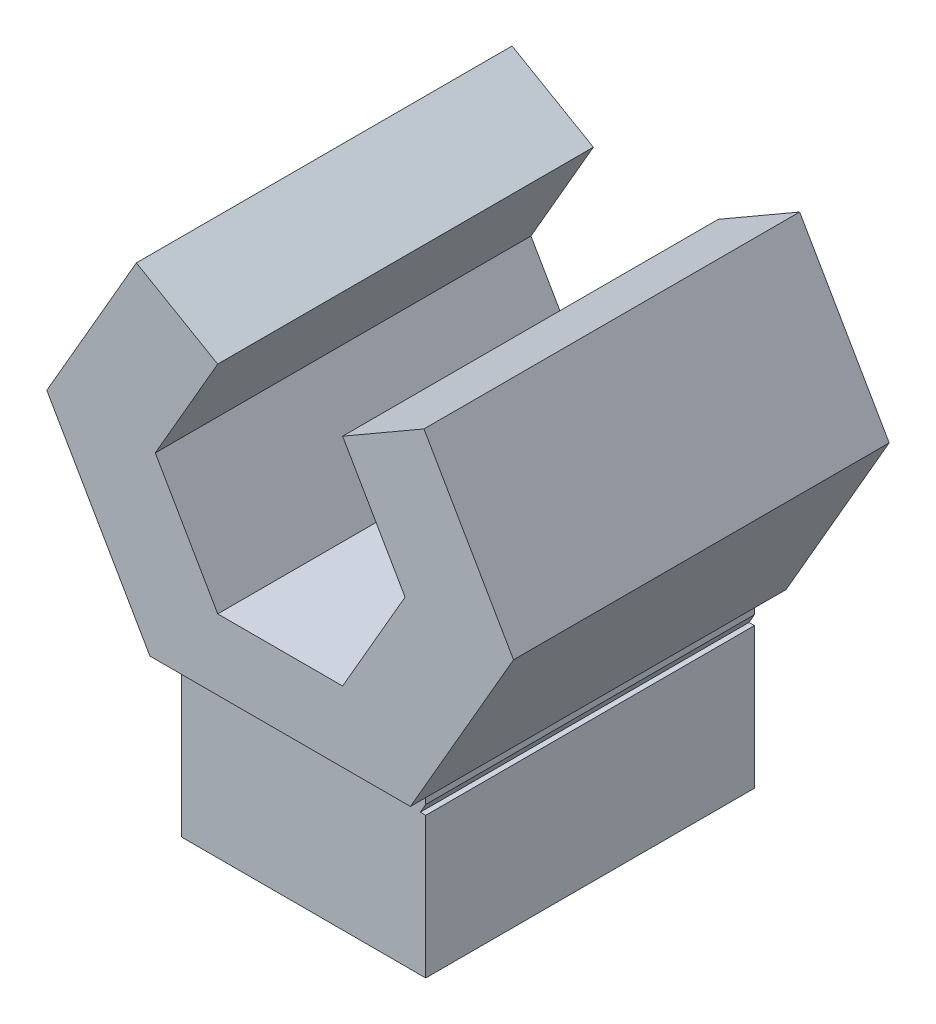
ISO-10303-21;
HEADER;
FILE_DESCRIPTION(('STEP AP214'),'2;1');
FILE_NAME('part.step','',(''),(''),'','','');
FILE_SCHEMA(('AUTOMOTIVE_DESIGN { 1 0 10303 214 1 1 1 1 }'));
ENDSEC;
DATA;
#1=APPLICATION_CONTEXT('core data for automotive mechanical design processes');
#2=APPLICATION_PROTOCOL_DEFINITION('international standard','automotive_design',2000,#1);
#3=PRODUCT_CONTEXT('',#1,'mechanical');
#4=PRODUCT('Part','Part','',(#3));
#5=PRODUCT_RELATED_PRODUCT_CATEGORY('part','',(#4));
#6=PRODUCT_DEFINITION_FORMATION('','',#4);
#7=PRODUCT_DEFINITION_CONTEXT('part definition',#1,'design');
#8=PRODUCT_DEFINITION('design','',#6,#7);
#9=PRODUCT_DEFINITION_SHAPE('','',#8);
#10=(LENGTH_UNIT() NAMED_UNIT(*) SI_UNIT(.MILLI.,.METRE.));
#11=(NAMED_UNIT(*) PLANE_ANGLE_UNIT() SI_UNIT($,.RADIAN.));
#12=(NAMED_UNIT(*) SI_UNIT($,.STERADIAN.) SOLID_ANGLE_UNIT());
#13=UNCERTAINTY_MEASURE_WITH_UNIT(LENGTH_MEASURE(1.E-05),#10,'distance_accuracy_value','');
#14=(GEOMETRIC_REPRESENTATION_CONTEXT(3) GLOBAL_UNCERTAINTY_ASSIGNED_CONTEXT((#13)) GLOBAL_UNIT_ASSIGNED_CONTEXT((#10,
#11,#12)) REPRESENTATION_CONTEXT('',''));
#15=CARTESIAN_POINT('',(0.,0.,0.));
#16=DIRECTION('',(0.,0.,1.));
#17=DIRECTION('',(1.,0.,0.));
#18=AXIS2_PLACEMENT_3D('',#15,#16,#17);
#19=CARTESIAN_POINT('',(-4.9694010767585,0.,8.));
#20=DIRECTION('',(0.866025403784439,0.5,0.));
#21=DIRECTION('',(-0.5,0.866025403784439,0.));
#22=AXIS2_PLACEMENT_3D('',#19,#20,#21);
#23=PLANE('',#22);
#24=DIRECTION('',(0.,0.,-1.));
#25=VECTOR('',#24,1.);
#26=CARTESIAN_POINT('',(-2.77337567297406,-3.80362757406661,8.));
#27=LINE('',#26,#25);
#28=CARTESIAN_POINT('',(-2.77337567297406,-3.80362757406661,8.));
#29=VERTEX_POINT('',#28);
#30=CARTESIAN_POINT('',(-2.77337567297406,-3.80362757406661,0.));
#31=VERTEX_POINT('',#30);
#32=EDGE_CURVE('E52',#29,#31,#27,.T.);
#33=ORIENTED_EDGE('',*,*,#32,.F.);
#34=DIRECTION('',(0.5,-0.866025403784439,0.));
#35=VECTOR('',#34,1.);
#36=CARTESIAN_POINT('',(-4.9694010767585,0.,8.));
#37=LINE('',#36,#35);
#38=CARTESIAN_POINT('',(-4.9694010767585,0.,8.));
#39=VERTEX_POINT('',#38);
#40=EDGE_CURVE('E306',#39,#29,#37,.T.);
#41=ORIENTED_EDGE('',*,*,#40,.F.);
#42=DIRECTION('',(0.,0.,-1.));
#43=VECTOR('',#42,1.);
#44=CARTESIAN_POINT('',(-4.9694010767585,0.,8.));
#45=LINE('',#44,#43);
#46=CARTESIAN_POINT('',(-4.9694010767585,0.,0.));
#47=VERTEX_POINT('',#46);
#48=EDGE_CURVE('E367',#39,#47,#45,.T.);
#49=ORIENTED_EDGE('',*,*,#48,.T.);
#50=DIRECTION('',(0.5,-0.866025403784439,0.));
#51=VECTOR('',#50,1.);
#52=CARTESIAN_POINT('',(-4.9694010767585,0.,0.));
#53=LINE('',#52,#51);
#54=EDGE_CURVE('E330',#47,#31,#53,.T.);
#55=ORIENTED_EDGE('',*,*,#54,.T.);
#56=EDGE_LOOP('',(#33,#41,#49,#55));
#57=FACE_BOUND('',#56,.T.);
#58=ADVANCED_FACE('F38',(#57),#23,.F.);
#59=CARTESIAN_POINT('',(2.48470053837924,-4.30362757406661,8.));
#60=DIRECTION('',(-0.866025403784439,0.5,0.));
#61=DIRECTION('',(-0.5,-0.866025403784439,0.));
#62=AXIS2_PLACEMENT_3D('',#59,#60,#61);
#63=PLANE('',#62);
#64=DIRECTION('',(0.,0.,1.));
#65=VECTOR('',#64,1.);
#66=CARTESIAN_POINT('',(2.77337567297406,-3.80362757406661,8.));
#67=LINE('',#66,#65);
#68=CARTESIAN_POINT('',(2.77337567297406,-3.80362757406661,0.));
#69=VERTEX_POINT('',#68);
#70=CARTESIAN_POINT('',(2.77337567297406,-3.80362757406661,8.));
#71=VERTEX_POINT('',#70);
#72=EDGE_CURVE('E289',#69,#71,#67,.T.);
#73=ORIENTED_EDGE('',*,*,#72,.F.);
#74=DIRECTION('',(0.5,0.866025403784439,0.));
#75=VECTOR('',#74,1.);
#76=CARTESIAN_POINT('',(2.48470053837924,-4.30362757406661,0.));
#77=LINE('',#76,#75);
#78=CARTESIAN_POINT('',(4.9694010767585,0.,0.));
#79=VERTEX_POINT('',#78);
#80=EDGE_CURVE('E333',#69,#79,#77,.T.);
#81=ORIENTED_EDGE('',*,*,#80,.T.);
#82=DIRECTION('',(0.,0.,-1.));
#83=VECTOR('',#82,1.);
#84=CARTESIAN_POINT('',(4.9694010767585,0.,8.));
#85=LINE('',#84,#83);
#86=CARTESIAN_POINT('',(4.9694010767585,0.,8.));
#87=VERTEX_POINT('',#86);
#88=EDGE_CURVE('E358',#87,#79,#85,.T.);
#89=ORIENTED_EDGE('',*,*,#88,.F.);
#90=DIRECTION('',(0.5,0.866025403784439,0.));
#91=VECTOR('',#90,1.);
#92=CARTESIAN_POINT('',(2.48470053837924,-4.30362757406661,8.));
#93=LINE('',#92,#91);
#94=EDGE_CURVE('E309',#71,#87,#93,.T.);
#95=ORIENTED_EDGE('',*,*,#94,.F.);
#96=EDGE_LOOP('',(#73,#81,#89,#95));
#97=FACE_BOUND('',#96,.T.);
#98=ADVANCED_FACE('F447',(#97),#63,.F.);
#99=CARTESIAN_POINT('',(0.,0.,8.));
#100=DIRECTION('',(0.,0.,1.));
#101=DIRECTION('',(1.,0.,0.));
#102=AXIS2_PLACEMENT_3D('',#99,#100,#101);
#103=PLANE('',#102);
#104=ORIENTED_EDGE('',*,*,#40,.T.);
#105=DIRECTION('',(1.,0.,0.));
#106=VECTOR('',#105,1.);
#107=CARTESIAN_POINT('',(0.,-3.80362757406661,8.));
#108=LINE('',#107,#106);
#109=EDGE_CURVE('E292',#29,#71,#108,.T.);
#110=ORIENTED_EDGE('',*,*,#109,.T.);
#111=ORIENTED_EDGE('',*,*,#94,.T.);
#112=DIRECTION('',(-0.5,0.866025403784439,0.));
#113=VECTOR('',#112,1.);
#114=CARTESIAN_POINT('',(4.9694010767585,0.,8.));
#115=LINE('',#114,#113);
#116=CARTESIAN_POINT('',(3.06205080756887,3.30362757406661,8.));
#117=VERTEX_POINT('',#116);
#118=EDGE_CURVE('E311',#87,#117,#115,.T.);
#119=ORIENTED_EDGE('',*,*,#118,.T.);
#120=DIRECTION('',(-0.866025403784438,-0.5,0.));
#121=VECTOR('',#120,1.);
#122=CARTESIAN_POINT('',(1.32999999999999,2.30362757406661,8.));
#123=LINE('',#122,#121);
#124=CARTESIAN_POINT('',(1.32999999999999,2.30362757406661,8.));
#125=VERTEX_POINT('',#124);
#126=EDGE_CURVE('E313',#117,#125,#123,.T.);
#127=ORIENTED_EDGE('',*,*,#126,.T.);
#128=DIRECTION('',(0.5,-0.866025403784438,0.));
#129=VECTOR('',#128,1.);
#130=CARTESIAN_POINT('',(2.66,0.,8.));
#131=LINE('',#130,#129);
#132=CARTESIAN_POINT('',(2.66,0.,8.));
#133=VERTEX_POINT('',#132);
#134=EDGE_CURVE('E315',#125,#133,#131,.T.);
#135=ORIENTED_EDGE('',*,*,#134,.T.);
#136=DIRECTION('',(-0.500000000000001,-0.866025403784438,0.));
#137=VECTOR('',#136,1.);
#138=CARTESIAN_POINT('',(1.32999999999999,-2.30362757406661,8.));
#139=LINE('',#138,#137);
#140=CARTESIAN_POINT('',(1.32999999999999,-2.30362757406661,8.));
#141=VERTEX_POINT('',#140);
#142=EDGE_CURVE('E317',#133,#141,#139,.T.);
#143=ORIENTED_EDGE('',*,*,#142,.T.);
#144=DIRECTION('',(-1.,0.,0.));
#145=VECTOR('',#144,1.);
#146=CARTESIAN_POINT('',(-1.33,-2.30362757406661,8.));
#147=LINE('',#146,#145);
#148=CARTESIAN_POINT('',(-1.33,-2.30362757406661,8.));
#149=VERTEX_POINT('',#148);
#150=EDGE_CURVE('E319',#141,#149,#147,.T.);
#151=ORIENTED_EDGE('',*,*,#150,.T.);
#152=DIRECTION('',(-0.499999999999997,0.86602540378444,0.));
#153=VECTOR('',#152,1.);
#154=CARTESIAN_POINT('',(-2.66,0.,8.));
#155=LINE('',#154,#153);
#156=CARTESIAN_POINT('',(-2.66,0.,8.));
#157=VERTEX_POINT('',#156);
#158=EDGE_CURVE('E296',#149,#157,#155,.T.);
#159=ORIENTED_EDGE('',*,*,#158,.T.);
#160=DIRECTION('',(0.499999999999999,0.866025403784439,0.));
#161=VECTOR('',#160,1.);
#162=CARTESIAN_POINT('',(-1.33,2.30362757406661,8.));
#163=LINE('',#162,#161);
#164=CARTESIAN_POINT('',(-1.33,2.30362757406661,8.));
#165=VERTEX_POINT('',#164);
#166=EDGE_CURVE('E299',#157,#165,#163,.T.);
#167=ORIENTED_EDGE('',*,*,#166,.T.);
#168=DIRECTION('',(-0.866025403784439,0.5,0.));
#169=VECTOR('',#168,1.);
#170=CARTESIAN_POINT('',(-3.06205080756888,3.30362757406661,8.));
#171=LINE('',#170,#169);
#172=CARTESIAN_POINT('',(-3.06205080756888,3.30362757406661,8.));
#173=VERTEX_POINT('',#172);
#174=EDGE_CURVE('E302',#165,#173,#171,.T.);
#175=ORIENTED_EDGE('',*,*,#174,.T.);
#176=DIRECTION('',(-0.5,-0.866025403784438,0.));
#177=VECTOR('',#176,1.);
#178=CARTESIAN_POINT('',(-3.06205080756888,3.30362757406661,8.));
#179=LINE('',#178,#177);
#180=EDGE_CURVE('E304',#173,#39,#179,.T.);
#181=ORIENTED_EDGE('',*,*,#180,.T.);
#182=EDGE_LOOP('',(#104,#110,#111,#119,#127,#135,#143,#151,#159,#167,#175,#181));
#183=FACE_BOUND('',#182,.T.);
#184=ADVANCED_FACE('F452',(#183),#103,.T.);
#185=CARTESIAN_POINT('',(0.,0.,0.));
#186=DIRECTION('',(0.,0.,1.));
#187=DIRECTION('',(1.,0.,0.));
#188=AXIS2_PLACEMENT_3D('',#185,#186,#187);
#189=PLANE('',#188);
#190=DIRECTION('',(1.,0.,0.));
#191=VECTOR('',#190,1.);
#192=CARTESIAN_POINT('',(0.,-3.80362757406661,0.));
#193=LINE('',#192,#191);
#194=EDGE_CURVE('E12',#31,#69,#193,.T.);
#195=ORIENTED_EDGE('',*,*,#194,.F.);
#196=ORIENTED_EDGE('',*,*,#54,.F.);
#197=DIRECTION('',(-0.5,-0.866025403784438,0.));
#198=VECTOR('',#197,1.);
#199=CARTESIAN_POINT('',(-3.06205080756888,3.30362757406661,0.));
#200=LINE('',#199,#198);
#201=CARTESIAN_POINT('',(-3.06205080756888,3.30362757406661,0.));
#202=VERTEX_POINT('',#201);
#203=EDGE_CURVE('E328',#202,#47,#200,.T.);
#204=ORIENTED_EDGE('',*,*,#203,.F.);
#205=DIRECTION('',(-0.866025403784439,0.5,0.));
#206=VECTOR('',#205,1.);
#207=CARTESIAN_POINT('',(-3.06205080756888,3.30362757406661,0.));
#208=LINE('',#207,#206);
#209=CARTESIAN_POINT('',(-1.33,2.30362757406661,0.));
#210=VERTEX_POINT('',#209);
#211=EDGE_CURVE('E326',#210,#202,#208,.T.);
#212=ORIENTED_EDGE('',*,*,#211,.F.);
#213=DIRECTION('',(0.499999999999999,0.866025403784439,0.));
#214=VECTOR('',#213,1.);
#215=CARTESIAN_POINT('',(-1.33,2.30362757406661,0.));
#216=LINE('',#215,#214);
#217=CARTESIAN_POINT('',(-2.66,0.,0.));
#218=VERTEX_POINT('',#217);
#219=EDGE_CURVE('E324',#218,#210,#216,.T.);
#220=ORIENTED_EDGE('',*,*,#219,.F.);
#221=DIRECTION('',(-0.499999999999997,0.86602540378444,0.));
#222=VECTOR('',#221,1.);
#223=CARTESIAN_POINT('',(-2.66,0.,0.));
#224=LINE('',#223,#222);
#225=CARTESIAN_POINT('',(-1.33,-2.30362757406661,0.));
#226=VERTEX_POINT('',#225);
#227=EDGE_CURVE('E295',#226,#218,#224,.T.);
#228=ORIENTED_EDGE('',*,*,#227,.F.);
#229=DIRECTION('',(-1.,0.,0.));
#230=VECTOR('',#229,1.);
#231=CARTESIAN_POINT('',(-1.33,-2.30362757406661,0.));
#232=LINE('',#231,#230);
#233=CARTESIAN_POINT('',(1.32999999999999,-2.30362757406661,0.));
#234=VERTEX_POINT('',#233);
#235=EDGE_CURVE('E300',#234,#226,#232,.T.);
#236=ORIENTED_EDGE('',*,*,#235,.F.);
#237=DIRECTION('',(-0.500000000000001,-0.866025403784438,0.));
#238=VECTOR('',#237,1.);
#239=CARTESIAN_POINT('',(1.32999999999999,-2.30362757406661,0.));
#240=LINE('',#239,#238);
#241=CARTESIAN_POINT('',(2.66,0.,0.));
#242=VERTEX_POINT('',#241);
#243=EDGE_CURVE('E341',#242,#234,#240,.T.);
#244=ORIENTED_EDGE('',*,*,#243,.F.);
#245=DIRECTION('',(0.5,-0.866025403784438,0.));
#246=VECTOR('',#245,1.);
#247=CARTESIAN_POINT('',(2.66,0.,0.));
#248=LINE('',#247,#246);
#249=CARTESIAN_POINT('',(1.32999999999999,2.30362757406661,0.));
#250=VERTEX_POINT('',#249);
#251=EDGE_CURVE('E339',#250,#242,#248,.T.);
#252=ORIENTED_EDGE('',*,*,#251,.F.);
#253=DIRECTION('',(-0.866025403784438,-0.5,0.));
#254=VECTOR('',#253,1.);
#255=CARTESIAN_POINT('',(1.32999999999999,2.30362757406661,0.));
#256=LINE('',#255,#254);
#257=CARTESIAN_POINT('',(3.06205080756887,3.30362757406661,0.));
#258=VERTEX_POINT('',#257);
#259=EDGE_CURVE('E337',#258,#250,#256,.T.);
#260=ORIENTED_EDGE('',*,*,#259,.F.);
#261=DIRECTION('',(-0.5,0.866025403784439,0.));
#262=VECTOR('',#261,1.);
#263=CARTESIAN_POINT('',(4.9694010767585,0.,0.));
#264=LINE('',#263,#262);
#265=EDGE_CURVE('E335',#79,#258,#264,.T.);
#266=ORIENTED_EDGE('',*,*,#265,.F.);
#267=ORIENTED_EDGE('',*,*,#80,.F.);
#268=EDGE_LOOP('',(#195,#196,#204,#212,#220,#228,#236,#244,#252,#260,#266,#267));
#269=FACE_BOUND('',#268,.T.);
#270=ADVANCED_FACE('F466',(#269),#189,.F.);
#271=CARTESIAN_POINT('',(-2.66,0.,8.));
#272=DIRECTION('',(-0.86602540378444,-0.499999999999997,0.));
#273=DIRECTION('',(0.499999999999997,-0.86602540378444,0.));
#274=AXIS2_PLACEMENT_3D('',#271,#272,#273);
#275=PLANE('',#274);
#276=ORIENTED_EDGE('',*,*,#227,.T.);
#277=DIRECTION('',(0.,0.,-1.));
#278=VECTOR('',#277,1.);
#279=CARTESIAN_POINT('',(-2.66,0.,8.));
#280=LINE('',#279,#278);
#281=EDGE_CURVE('E376',#157,#218,#280,.T.);
#282=ORIENTED_EDGE('',*,*,#281,.F.);
#283=ORIENTED_EDGE('',*,*,#158,.F.);
#284=DIRECTION('',(0.,0.,-1.));
#285=VECTOR('',#284,1.);
#286=CARTESIAN_POINT('',(-1.33,-2.30362757406661,8.));
#287=LINE('',#286,#285);
#288=EDGE_CURVE('E321',#149,#226,#287,.T.);
#289=ORIENTED_EDGE('',*,*,#288,.T.);
#290=EDGE_LOOP('',(#276,#282,#283,#289));
#291=FACE_BOUND('',#290,.T.);
#292=ADVANCED_FACE('F40',(#291),#275,.F.);
#293=CARTESIAN_POINT('',(-1.33,2.30362757406661,8.));
#294=DIRECTION('',(-0.866025403784439,0.499999999999999,0.));
#295=DIRECTION('',(-0.499999999999999,-0.866025403784439,0.));
#296=AXIS2_PLACEMENT_3D('',#293,#294,#295);
#297=PLANE('',#296);
#298=ORIENTED_EDGE('',*,*,#219,.T.);
#299=DIRECTION('',(0.,0.,-1.));
#300=VECTOR('',#299,1.);
#301=CARTESIAN_POINT('',(-1.33,2.30362757406661,8.));
#302=LINE('',#301,#300);
#303=EDGE_CURVE('E373',#165,#210,#302,.T.);
#304=ORIENTED_EDGE('',*,*,#303,.F.);
#305=ORIENTED_EDGE('',*,*,#166,.F.);
#306=ORIENTED_EDGE('',*,*,#281,.T.);
#307=EDGE_LOOP('',(#298,#304,#305,#306));
#308=FACE_BOUND('',#307,.T.);
#309=ADVANCED_FACE('F502',(#308),#297,.F.);
#310=CARTESIAN_POINT('',(-3.06205080756888,3.30362757406661,8.));
#311=DIRECTION('',(-0.5,-0.866025403784439,0.));
#312=DIRECTION('',(0.866025403784439,-0.5,0.));
#313=AXIS2_PLACEMENT_3D('',#310,#311,#312);
#314=PLANE('',#313);
#315=ORIENTED_EDGE('',*,*,#211,.T.);
#316=DIRECTION('',(0.,0.,-1.));
#317=VECTOR('',#316,1.);
#318=CARTESIAN_POINT('',(-3.06205080756888,3.30362757406661,8.));
#319=LINE('',#318,#317);
#320=EDGE_CURVE('E370',#173,#202,#319,.T.);
#321=ORIENTED_EDGE('',*,*,#320,.F.);
#322=ORIENTED_EDGE('',*,*,#174,.F.);
#323=ORIENTED_EDGE('',*,*,#303,.T.);
#324=EDGE_LOOP('',(#315,#321,#322,#323));
#325=FACE_BOUND('',#324,.T.);
#326=ADVANCED_FACE('F504',(#325),#314,.F.);
#327=CARTESIAN_POINT('',(-3.06205080756888,3.30362757406661,8.));
#328=DIRECTION('',(0.866025403784439,-0.5,0.));
#329=DIRECTION('',(0.5,0.866025403784439,0.));
#330=AXIS2_PLACEMENT_3D('',#327,#328,#329);
#331=PLANE('',#330);
#332=ORIENTED_EDGE('',*,*,#203,.T.);
#333=ORIENTED_EDGE('',*,*,#48,.F.);
#334=ORIENTED_EDGE('',*,*,#180,.F.);
#335=ORIENTED_EDGE('',*,*,#320,.T.);
#336=EDGE_LOOP('',(#332,#333,#334,#335));
#337=FACE_BOUND('',#336,.T.);
#338=ADVANCED_FACE('F463',(#337),#331,.F.);
#339=CARTESIAN_POINT('',(4.9694010767585,0.,8.));
#340=DIRECTION('',(-0.866025403784439,-0.5,0.));
#341=DIRECTION('',(0.5,-0.866025403784439,0.));
#342=AXIS2_PLACEMENT_3D('',#339,#340,#341);
#343=PLANE('',#342);
#344=ORIENTED_EDGE('',*,*,#265,.T.);
#345=DIRECTION('',(0.,0.,-1.));
#346=VECTOR('',#345,1.);
#347=CARTESIAN_POINT('',(3.06205080756887,3.30362757406661,8.));
#348=LINE('',#347,#346);
#349=EDGE_CURVE('E355',#117,#258,#348,.T.);
#350=ORIENTED_EDGE('',*,*,#349,.F.);
#351=ORIENTED_EDGE('',*,*,#118,.F.);
#352=ORIENTED_EDGE('',*,*,#88,.T.);
#353=EDGE_LOOP('',(#344,#350,#351,#352));
#354=FACE_BOUND('',#353,.T.);
#355=ADVANCED_FACE('F477',(#354),#343,.F.);
#356=CARTESIAN_POINT('',(1.32999999999999,2.30362757406661,8.));
#357=DIRECTION('',(0.5,-0.866025403784438,0.));
#358=DIRECTION('',(0.866025403784439,0.5,0.));
#359=AXIS2_PLACEMENT_3D('',#356,#357,#358);
#360=PLANE('',#359);
#361=ORIENTED_EDGE('',*,*,#259,.T.);
#362=DIRECTION('',(0.,0.,-1.));
#363=VECTOR('',#362,1.);
#364=CARTESIAN_POINT('',(1.32999999999999,2.30362757406661,8.));
#365=LINE('',#364,#363);
#366=EDGE_CURVE('E352',#125,#250,#365,.T.);
#367=ORIENTED_EDGE('',*,*,#366,.F.);
#368=ORIENTED_EDGE('',*,*,#126,.F.);
#369=ORIENTED_EDGE('',*,*,#349,.T.);
#370=EDGE_LOOP('',(#361,#367,#368,#369));
#371=FACE_BOUND('',#370,.T.);
#372=ADVANCED_FACE('F480',(#371),#360,.F.);
#373=CARTESIAN_POINT('',(2.66,0.,8.));
#374=DIRECTION('',(0.866025403784439,0.5,0.));
#375=DIRECTION('',(-0.5,0.866025403784438,0.));
#376=AXIS2_PLACEMENT_3D('',#373,#374,#375);
#377=PLANE('',#376);
#378=ORIENTED_EDGE('',*,*,#251,.T.);
#379=DIRECTION('',(0.,0.,-1.));
#380=VECTOR('',#379,1.);
#381=CARTESIAN_POINT('',(2.66,0.,8.));
#382=LINE('',#381,#380);
#383=EDGE_CURVE('E349',#133,#242,#382,.T.);
#384=ORIENTED_EDGE('',*,*,#383,.F.);
#385=ORIENTED_EDGE('',*,*,#134,.F.);
#386=ORIENTED_EDGE('',*,*,#366,.T.);
#387=EDGE_LOOP('',(#378,#384,#385,#386));
#388=FACE_BOUND('',#387,.T.);
#389=ADVANCED_FACE('F485',(#388),#377,.F.);
#390=CARTESIAN_POINT('',(1.32999999999999,-2.30362757406661,8.));
#391=DIRECTION('',(0.866025403784438,-0.500000000000001,0.));
#392=DIRECTION('',(0.500000000000001,0.866025403784438,0.));
#393=AXIS2_PLACEMENT_3D('',#390,#391,#392);
#394=PLANE('',#393);
#395=ORIENTED_EDGE('',*,*,#243,.T.);
#396=DIRECTION('',(0.,0.,-1.));
#397=VECTOR('',#396,1.);
#398=CARTESIAN_POINT('',(1.32999999999999,-2.30362757406661,8.));
#399=LINE('',#398,#397);
#400=EDGE_CURVE('E346',#141,#234,#399,.T.);
#401=ORIENTED_EDGE('',*,*,#400,.F.);
#402=ORIENTED_EDGE('',*,*,#142,.F.);
#403=ORIENTED_EDGE('',*,*,#383,.T.);
#404=EDGE_LOOP('',(#395,#401,#402,#403));
#405=FACE_BOUND('',#404,.T.);
#406=ADVANCED_FACE('F491',(#405),#394,.F.);
#407=CARTESIAN_POINT('',(-1.33,-2.30362757406661,8.));
#408=DIRECTION('',(0.,-1.,0.));
#409=DIRECTION('',(1.,0.,0.));
#410=AXIS2_PLACEMENT_3D('',#407,#408,#409);
#411=PLANE('',#410);
#412=ORIENTED_EDGE('',*,*,#235,.T.);
#413=ORIENTED_EDGE('',*,*,#288,.F.);
#414=ORIENTED_EDGE('',*,*,#150,.F.);
#415=ORIENTED_EDGE('',*,*,#400,.T.);
#416=EDGE_LOOP('',(#412,#413,#414,#415));
#417=FACE_BOUND('',#416,.T.);
#418=ADVANCED_FACE('F495',(#417),#411,.F.);
#419=CARTESIAN_POINT('',(-2.6,-3.80362757406661,7.5));
#420=DIRECTION('',(-1.,0.,0.));
#421=DIRECTION('',(0.,0.,1.));
#422=AXIS2_PLACEMENT_3D('',#419,#420,#421);
#423=PLANE('',#422);
#424=DIRECTION('',(0.,0.,1.));
#425=VECTOR('',#424,1.);
#426=CARTESIAN_POINT('',(-2.6,-4.10392304845413,8.));
#427=LINE('',#426,#425);
#428=CARTESIAN_POINT('',(-2.6,-4.10392304845413,0.500000000000001));
#429=VERTEX_POINT('',#428);
#430=CARTESIAN_POINT('',(-2.6,-4.10392304845412,7.5));
#431=VERTEX_POINT('',#430);
#432=EDGE_CURVE('E227',#429,#431,#427,.T.);
#433=ORIENTED_EDGE('',*,*,#432,.T.);
#434=DIRECTION('',(0.,-1.,0.));
#435=VECTOR('',#434,1.);
#436=CARTESIAN_POINT('',(-2.6,-3.80362757406661,7.5));
#437=LINE('',#436,#435);
#438=CARTESIAN_POINT('',(-2.6,-3.80362757406661,7.5));
#439=VERTEX_POINT('',#438);
#440=EDGE_CURVE('E224',#439,#431,#437,.T.);
#441=ORIENTED_EDGE('',*,*,#440,.F.);
#442=DIRECTION('',(0.,0.,-1.));
#443=VECTOR('',#442,1.);
#444=CARTESIAN_POINT('',(-2.6,-3.80362757406661,7.5));
#445=LINE('',#444,#443);
#446=CARTESIAN_POINT('',(-2.6,-3.80362757406661,0.500000000000001));
#447=VERTEX_POINT('',#446);
#448=EDGE_CURVE('E212',#439,#447,#445,.T.);
#449=ORIENTED_EDGE('',*,*,#448,.T.);
#450=DIRECTION('',(0.,-1.,0.));
#451=VECTOR('',#450,1.);
#452=CARTESIAN_POINT('',(-2.6,-3.80362757406661,0.500000000000001));
#453=LINE('',#452,#451);
#454=EDGE_CURVE('E411',#447,#429,#453,.T.);
#455=ORIENTED_EDGE('',*,*,#454,.T.);
#456=EDGE_LOOP('',(#433,#441,#449,#455));
#457=FACE_BOUND('',#456,.T.);
#458=ADVANCED_FACE('F225',(#457),#423,.T.);
#459=DIRECTION('',(0.,0.,-1.));
#460=VECTOR('',#459,1.);
#461=CARTESIAN_POINT('',(-2.6,-4.30362757406661,0.));
#462=LINE('',#461,#460);
#463=CARTESIAN_POINT('',(-2.6,-4.30362757406661,7.5));
#464=VERTEX_POINT('',#463);
#465=CARTESIAN_POINT('',(-2.6,-4.30362757406661,0.500000000000001));
#466=VERTEX_POINT('',#465);
#467=EDGE_CURVE('E286',#464,#466,#462,.T.);
#468=ORIENTED_EDGE('',*,*,#467,.T.);
#469=CARTESIAN_POINT('',(-2.6,-7.30362757406661,0.500000000000001));
#470=VERTEX_POINT('',#469);
#471=EDGE_CURVE('E410',#466,#470,#453,.T.);
#472=ORIENTED_EDGE('',*,*,#471,.T.);
#473=DIRECTION('',(0.,0.,-1.));
#474=VECTOR('',#473,1.);
#475=CARTESIAN_POINT('',(-2.6,-7.30362757406661,7.5));
#476=LINE('',#475,#474);
#477=CARTESIAN_POINT('',(-2.6,-7.30362757406661,7.5));
#478=VERTEX_POINT('',#477);
#479=EDGE_CURVE('E415',#478,#470,#476,.T.);
#480=ORIENTED_EDGE('',*,*,#479,.F.);
#481=EDGE_CURVE('E229',#464,#478,#437,.T.);
#482=ORIENTED_EDGE('',*,*,#481,.F.);
#483=EDGE_LOOP('',(#468,#472,#480,#482));
#484=FACE_BOUND('',#483,.T.);
#485=ADVANCED_FACE('F558',(#484),#423,.T.);
#486=CARTESIAN_POINT('',(2.6,-3.80362757406661,7.5));
#487=DIRECTION('',(1.,0.,0.));
#488=DIRECTION('',(0.,0.,-1.));
#489=AXIS2_PLACEMENT_3D('',#486,#487,#488);
#490=PLANE('',#489);
#491=DIRECTION('',(0.,0.,-1.));
#492=VECTOR('',#491,1.);
#493=CARTESIAN_POINT('',(2.6,-4.10392304845412,8.));
#494=LINE('',#493,#492);
#495=CARTESIAN_POINT('',(2.6,-4.10392304845412,7.5));
#496=VERTEX_POINT('',#495);
#497=CARTESIAN_POINT('',(2.6,-4.10392304845412,0.500000000000001));
#498=VERTEX_POINT('',#497);
#499=EDGE_CURVE('E284',#496,#498,#494,.T.);
#500=ORIENTED_EDGE('',*,*,#499,.T.);
#501=DIRECTION('',(0.,-1.,0.));
#502=VECTOR('',#501,1.);
#503=CARTESIAN_POINT('',(2.6,-3.80362757406661,0.500000000000001));
#504=LINE('',#503,#502);
#505=CARTESIAN_POINT('',(2.6,-3.80362757406661,0.500000000000001));
#506=VERTEX_POINT('',#505);
#507=EDGE_CURVE('E400',#506,#498,#504,.T.);
#508=ORIENTED_EDGE('',*,*,#507,.F.);
#509=DIRECTION('',(0.,0.,1.));
#510=VECTOR('',#509,1.);
#511=CARTESIAN_POINT('',(2.6,-3.80362757406661,7.5));
#512=LINE('',#511,#510);
#513=CARTESIAN_POINT('',(2.6,-3.80362757406661,7.5));
#514=VERTEX_POINT('',#513);
#515=EDGE_CURVE('E234',#506,#514,#512,.T.);
#516=ORIENTED_EDGE('',*,*,#515,.T.);
#517=DIRECTION('',(0.,-1.,0.));
#518=VECTOR('',#517,1.);
#519=CARTESIAN_POINT('',(2.6,-3.80362757406661,7.5));
#520=LINE('',#519,#518);
#521=EDGE_CURVE('E233',#514,#496,#520,.T.);
#522=ORIENTED_EDGE('',*,*,#521,.T.);
#523=EDGE_LOOP('',(#500,#508,#516,#522));
#524=FACE_BOUND('',#523,.T.);
#525=ADVANCED_FACE('F409',(#524),#490,.T.);
#526=DIRECTION('',(0.,0.,1.));
#527=VECTOR('',#526,1.);
#528=CARTESIAN_POINT('',(2.6,-4.30362757406661,0.));
#529=LINE('',#528,#527);
#530=CARTESIAN_POINT('',(2.6,-4.30362757406661,0.500000000000001));
#531=VERTEX_POINT('',#530);
#532=CARTESIAN_POINT('',(2.6,-4.30362757406661,7.5));
#533=VERTEX_POINT('',#532);
#534=EDGE_CURVE('E381',#531,#533,#529,.T.);
#535=ORIENTED_EDGE('',*,*,#534,.T.);
#536=CARTESIAN_POINT('',(2.6,-7.30362757406661,7.5));
#537=VERTEX_POINT('',#536);
#538=EDGE_CURVE('E228',#533,#537,#520,.T.);
#539=ORIENTED_EDGE('',*,*,#538,.T.);
#540=DIRECTION('',(0.,0.,1.));
#541=VECTOR('',#540,1.);
#542=CARTESIAN_POINT('',(2.6,-7.30362757406661,7.5));
#543=LINE('',#542,#541);
#544=CARTESIAN_POINT('',(2.6,-7.30362757406661,0.500000000000001));
#545=VERTEX_POINT('',#544);
#546=EDGE_CURVE('E257',#545,#537,#543,.T.);
#547=ORIENTED_EDGE('',*,*,#546,.F.);
#548=EDGE_CURVE('E388',#531,#545,#504,.T.);
#549=ORIENTED_EDGE('',*,*,#548,.F.);
#550=EDGE_LOOP('',(#535,#539,#547,#549));
#551=FACE_BOUND('',#550,.T.);
#552=ADVANCED_FACE('F396',(#551),#490,.T.);
#553=CARTESIAN_POINT('',(-2.6,-3.80362757406661,0.500000000000001));
#554=DIRECTION('',(0.,0.,-1.));
#555=DIRECTION('',(-1.,0.,0.));
#556=AXIS2_PLACEMENT_3D('',#553,#554,#555);
#557=PLANE('',#556);
#558=DIRECTION('',(-0.5,0.866025403784439,0.));
#559=VECTOR('',#558,1.);
#560=CARTESIAN_POINT('',(-4.9694010767585,0.,0.500000000000001));
#561=LINE('',#560,#559);
#562=CARTESIAN_POINT('',(-2.48470053837925,-4.30362757406661,0.500000000000001));
#563=VERTEX_POINT('',#562);
#564=EDGE_CURVE('E282',#563,#429,#561,.T.);
#565=ORIENTED_EDGE('',*,*,#564,.T.);
#566=ORIENTED_EDGE('',*,*,#454,.F.);
#567=DIRECTION('',(1.,0.,0.));
#568=VECTOR('',#567,1.);
#569=CARTESIAN_POINT('',(-2.6,-3.80362757406661,0.500000000000001));
#570=LINE('',#569,#568);
#571=EDGE_CURVE('E220',#447,#506,#570,.T.);
#572=ORIENTED_EDGE('',*,*,#571,.T.);
#573=ORIENTED_EDGE('',*,*,#507,.T.);
#574=DIRECTION('',(-0.5,-0.866025403784439,0.));
#575=VECTOR('',#574,1.);
#576=CARTESIAN_POINT('',(2.48470053837924,-4.30362757406661,0.500000000000001));
#577=LINE('',#576,#575);
#578=CARTESIAN_POINT('',(2.48470053837924,-4.30362757406661,0.500000000000001));
#579=VERTEX_POINT('',#578);
#580=EDGE_CURVE('E278',#498,#579,#577,.T.);
#581=ORIENTED_EDGE('',*,*,#580,.T.);
#582=DIRECTION('',(1.,0.,0.));
#583=VECTOR('',#582,1.);
#584=CARTESIAN_POINT('',(0.,-4.30362757406661,0.500000000000001));
#585=LINE('',#584,#583);
#586=EDGE_CURVE('E46',#579,#531,#585,.T.);
#587=ORIENTED_EDGE('',*,*,#586,.T.);
#588=ORIENTED_EDGE('',*,*,#548,.T.);
#589=DIRECTION('',(1.,0.,0.));
#590=VECTOR('',#589,1.);
#591=CARTESIAN_POINT('',(-2.6,-7.30362757406661,0.500000000000001));
#592=LINE('',#591,#590);
#593=EDGE_CURVE('E236',#470,#545,#592,.T.);
#594=ORIENTED_EDGE('',*,*,#593,.F.);
#595=ORIENTED_EDGE('',*,*,#471,.F.);
#596=DIRECTION('',(1.,0.,0.));
#597=VECTOR('',#596,1.);
#598=CARTESIAN_POINT('',(0.,-4.30362757406661,0.500000000000001));
#599=LINE('',#598,#597);
#600=EDGE_CURVE('E280',#466,#563,#599,.T.);
#601=ORIENTED_EDGE('',*,*,#600,.T.);
#602=EDGE_LOOP('',(#565,#566,#572,#573,#581,#587,#588,#594,#595,#601));
#603=FACE_BOUND('',#602,.T.);
#604=ADVANCED_FACE('F386',(#603),#557,.T.);
#605=CARTESIAN_POINT('',(-2.6,-3.80362757406661,7.5));
#606=DIRECTION('',(0.,0.,1.));
#607=DIRECTION('',(1.,0.,0.));
#608=AXIS2_PLACEMENT_3D('',#605,#606,#607);
#609=PLANE('',#608);
#610=DIRECTION('',(0.5,-0.866025403784439,0.));
#611=VECTOR('',#610,1.);
#612=CARTESIAN_POINT('',(-4.9694010767585,0.,7.5));
#613=LINE('',#612,#611);
#614=CARTESIAN_POINT('',(-2.48470053837925,-4.30362757406661,7.5));
#615=VERTEX_POINT('',#614);
#616=EDGE_CURVE('E60',#431,#615,#613,.T.);
#617=ORIENTED_EDGE('',*,*,#616,.T.);
#618=DIRECTION('',(-1.,0.,0.));
#619=VECTOR('',#618,1.);
#620=CARTESIAN_POINT('',(0.,-4.30362757406661,7.5));
#621=LINE('',#620,#619);
#622=EDGE_CURVE('E275',#615,#464,#621,.T.);
#623=ORIENTED_EDGE('',*,*,#622,.T.);
#624=ORIENTED_EDGE('',*,*,#481,.T.);
#625=DIRECTION('',(-1.,0.,0.));
#626=VECTOR('',#625,1.);
#627=CARTESIAN_POINT('',(-2.6,-7.30362757406661,7.5));
#628=LINE('',#627,#626);
#629=EDGE_CURVE('E418',#537,#478,#628,.T.);
#630=ORIENTED_EDGE('',*,*,#629,.F.);
#631=ORIENTED_EDGE('',*,*,#538,.F.);
#632=DIRECTION('',(-1.,0.,0.));
#633=VECTOR('',#632,1.);
#634=CARTESIAN_POINT('',(0.,-4.30362757406661,7.5));
#635=LINE('',#634,#633);
#636=CARTESIAN_POINT('',(2.48470053837924,-4.30362757406661,7.5));
#637=VERTEX_POINT('',#636);
#638=EDGE_CURVE('E379',#533,#637,#635,.T.);
#639=ORIENTED_EDGE('',*,*,#638,.T.);
#640=DIRECTION('',(0.5,0.866025403784439,0.));
#641=VECTOR('',#640,1.);
#642=CARTESIAN_POINT('',(2.48470053837924,-4.30362757406661,7.5));
#643=LINE('',#642,#641);
#644=EDGE_CURVE('E267',#637,#496,#643,.T.);
#645=ORIENTED_EDGE('',*,*,#644,.T.);
#646=ORIENTED_EDGE('',*,*,#521,.F.);
#647=DIRECTION('',(-1.,0.,0.));
#648=VECTOR('',#647,1.);
#649=CARTESIAN_POINT('',(-2.6,-3.80362757406661,7.5));
#650=LINE('',#649,#648);
#651=EDGE_CURVE('E217',#514,#439,#650,.T.);
#652=ORIENTED_EDGE('',*,*,#651,.T.);
#653=ORIENTED_EDGE('',*,*,#440,.T.);
#654=EDGE_LOOP('',(#617,#623,#624,#630,#631,#639,#645,#646,#652,#653));
#655=FACE_BOUND('',#654,.T.);
#656=ADVANCED_FACE('F231',(#655),#609,.T.);
#657=CARTESIAN_POINT('',(0.,-3.80362757406661,4.));
#658=DIRECTION('',(0.,-1.,0.));
#659=DIRECTION('',(0.,0.,-1.));
#660=AXIS2_PLACEMENT_3D('',#657,#658,#659);
#661=PLANE('',#660);
#662=ORIENTED_EDGE('',*,*,#32,.T.);
#663=ORIENTED_EDGE('',*,*,#194,.T.);
#664=ORIENTED_EDGE('',*,*,#72,.T.);
#665=ORIENTED_EDGE('',*,*,#109,.F.);
#666=EDGE_LOOP('',(#662,#663,#664,#665));
#667=FACE_BOUND('',#666,.T.);
#668=ORIENTED_EDGE('',*,*,#571,.F.);
#669=ORIENTED_EDGE('',*,*,#448,.F.);
#670=ORIENTED_EDGE('',*,*,#651,.F.);
#671=ORIENTED_EDGE('',*,*,#515,.F.);
#672=EDGE_LOOP('',(#668,#669,#670,#671));
#673=FACE_BOUND('',#672,.T.);
#674=ADVANCED_FACE('F214',(#667,#673),#661,.T.);
#675=CARTESIAN_POINT('',(0.,-7.30362757406661,0.));
#676=DIRECTION('',(0.,-1.,0.));
#677=DIRECTION('',(0.,0.,-1.));
#678=AXIS2_PLACEMENT_3D('',#675,#676,#677);
#679=PLANE('',#678);
#680=DIRECTION('',(0.,0.,1.));
#681=VECTOR('',#680,1.);
#682=CARTESIAN_POINT('',(0.999999999999999,-7.30362757406661,6.5));
#683=LINE('',#682,#681);
#684=CARTESIAN_POINT('',(1.,-7.30362757406661,1.5));
#685=VERTEX_POINT('',#684);
#686=CARTESIAN_POINT('',(0.999999999999999,-7.30362757406661,6.5));
#687=VERTEX_POINT('',#686);
#688=EDGE_CURVE('E254',#685,#687,#683,.T.);
#689=ORIENTED_EDGE('',*,*,#688,.F.);
#690=DIRECTION('',(1.,0.,0.));
#691=VECTOR('',#690,1.);
#692=CARTESIAN_POINT('',(-1.,-7.30362757406661,1.5));
#693=LINE('',#692,#691);
#694=CARTESIAN_POINT('',(-1.,-7.30362757406661,1.5));
#695=VERTEX_POINT('',#694);
#696=EDGE_CURVE('E244',#695,#685,#693,.T.);
#697=ORIENTED_EDGE('',*,*,#696,.F.);
#698=DIRECTION('',(0.,0.,-1.));
#699=VECTOR('',#698,1.);
#700=CARTESIAN_POINT('',(-1.,-7.30362757406661,6.5));
#701=LINE('',#700,#699);
#702=CARTESIAN_POINT('',(-1.,-7.30362757406661,6.5));
#703=VERTEX_POINT('',#702);
#704=EDGE_CURVE('E260',#703,#695,#701,.T.);
#705=ORIENTED_EDGE('',*,*,#704,.F.);
#706=DIRECTION('',(-1.,0.,0.));
#707=VECTOR('',#706,1.);
#708=CARTESIAN_POINT('',(-1.,-7.30362757406661,6.5));
#709=LINE('',#708,#707);
#710=EDGE_CURVE('E256',#687,#703,#709,.T.);
#711=ORIENTED_EDGE('',*,*,#710,.F.);
#712=EDGE_LOOP('',(#689,#697,#705,#711));
#713=FACE_BOUND('',#712,.T.);
#714=ORIENTED_EDGE('',*,*,#593,.T.);
#715=ORIENTED_EDGE('',*,*,#546,.T.);
#716=ORIENTED_EDGE('',*,*,#629,.T.);
#717=ORIENTED_EDGE('',*,*,#479,.T.);
#718=EDGE_LOOP('',(#714,#715,#716,#717));
#719=FACE_BOUND('',#718,.T.);
#720=ADVANCED_FACE('F425',(#713,#719),#679,.T.);
#721=CARTESIAN_POINT('',(0.999999999999999,-3.80362757406661,6.5));
#722=DIRECTION('',(1.,0.,0.));
#723=DIRECTION('',(0.,0.,-1.));
#724=AXIS2_PLACEMENT_3D('',#721,#722,#723);
#725=PLANE('',#724);
#726=ORIENTED_EDGE('',*,*,#688,.T.);
#727=DIRECTION('',(0.,-1.,0.));
#728=VECTOR('',#727,1.);
#729=CARTESIAN_POINT('',(0.999999999999999,-3.80362757406661,6.5));
#730=LINE('',#729,#728);
#731=CARTESIAN_POINT('',(0.999999999999999,-3.80362757406661,6.5));
#732=VERTEX_POINT('',#731);
#733=EDGE_CURVE('E253',#732,#687,#730,.T.);
#734=ORIENTED_EDGE('',*,*,#733,.F.);
#735=DIRECTION('',(0.,0.,1.));
#736=VECTOR('',#735,1.);
#737=CARTESIAN_POINT('',(0.999999999999999,-3.80362757406661,6.5));
#738=LINE('',#737,#736);
#739=CARTESIAN_POINT('',(1.,-3.80362757406661,1.5));
#740=VERTEX_POINT('',#739);
#741=EDGE_CURVE('E240',#740,#732,#738,.T.);
#742=ORIENTED_EDGE('',*,*,#741,.F.);
#743=DIRECTION('',(0.,-1.,0.));
#744=VECTOR('',#743,1.);
#745=CARTESIAN_POINT('',(1.,-3.80362757406661,1.5));
#746=LINE('',#745,#744);
#747=EDGE_CURVE('E265',#740,#685,#746,.T.);
#748=ORIENTED_EDGE('',*,*,#747,.T.);
#749=EDGE_LOOP('',(#726,#734,#742,#748));
#750=FACE_BOUND('',#749,.T.);
#751=ADVANCED_FACE('F599',(#750),#725,.F.);
#752=CARTESIAN_POINT('',(-1.,-3.80362757406661,1.5));
#753=DIRECTION('',(0.,0.,-1.));
#754=DIRECTION('',(-1.,0.,0.));
#755=AXIS2_PLACEMENT_3D('',#752,#753,#754);
#756=PLANE('',#755);
#757=ORIENTED_EDGE('',*,*,#696,.T.);
#758=ORIENTED_EDGE('',*,*,#747,.F.);
#759=DIRECTION('',(1.,0.,0.));
#760=VECTOR('',#759,1.);
#761=CARTESIAN_POINT('',(-1.,-3.80362757406661,1.5));
#762=LINE('',#761,#760);
#763=CARTESIAN_POINT('',(-1.,-3.80362757406661,1.5));
#764=VERTEX_POINT('',#763);
#765=EDGE_CURVE('E250',#764,#740,#762,.T.);
#766=ORIENTED_EDGE('',*,*,#765,.F.);
#767=DIRECTION('',(0.,-1.,0.));
#768=VECTOR('',#767,1.);
#769=CARTESIAN_POINT('',(-1.,-3.80362757406661,1.5));
#770=LINE('',#769,#768);
#771=EDGE_CURVE('E268',#764,#695,#770,.T.);
#772=ORIENTED_EDGE('',*,*,#771,.T.);
#773=EDGE_LOOP('',(#757,#758,#766,#772));
#774=FACE_BOUND('',#773,.T.);
#775=ADVANCED_FACE('F607',(#774),#756,.F.);
#776=CARTESIAN_POINT('',(-1.,-3.80362757406661,6.5));
#777=DIRECTION('',(-1.,0.,0.));
#778=DIRECTION('',(0.,0.,1.));
#779=AXIS2_PLACEMENT_3D('',#776,#777,#778);
#780=PLANE('',#779);
#781=ORIENTED_EDGE('',*,*,#704,.T.);
#782=ORIENTED_EDGE('',*,*,#771,.F.);
#783=DIRECTION('',(0.,0.,-1.));
#784=VECTOR('',#783,1.);
#785=CARTESIAN_POINT('',(-1.,-3.80362757406661,6.5));
#786=LINE('',#785,#784);
#787=CARTESIAN_POINT('',(-1.,-3.80362757406661,6.5));
#788=VERTEX_POINT('',#787);
#789=EDGE_CURVE('E247',#788,#764,#786,.T.);
#790=ORIENTED_EDGE('',*,*,#789,.F.);
#791=DIRECTION('',(0.,-1.,0.));
#792=VECTOR('',#791,1.);
#793=CARTESIAN_POINT('',(-1.,-3.80362757406661,6.5));
#794=LINE('',#793,#792);
#795=EDGE_CURVE('E270',#788,#703,#794,.T.);
#796=ORIENTED_EDGE('',*,*,#795,.T.);
#797=EDGE_LOOP('',(#781,#782,#790,#796));
#798=FACE_BOUND('',#797,.T.);
#799=ADVANCED_FACE('F615',(#798),#780,.F.);
#800=CARTESIAN_POINT('',(-1.,-3.80362757406661,6.5));
#801=DIRECTION('',(0.,0.,1.));
#802=DIRECTION('',(1.,0.,0.));
#803=AXIS2_PLACEMENT_3D('',#800,#801,#802);
#804=PLANE('',#803);
#805=ORIENTED_EDGE('',*,*,#710,.T.);
#806=ORIENTED_EDGE('',*,*,#795,.F.);
#807=DIRECTION('',(-1.,0.,0.));
#808=VECTOR('',#807,1.);
#809=CARTESIAN_POINT('',(-1.,-3.80362757406661,6.5));
#810=LINE('',#809,#808);
#811=EDGE_CURVE('E243',#732,#788,#810,.T.);
#812=ORIENTED_EDGE('',*,*,#811,.F.);
#813=ORIENTED_EDGE('',*,*,#733,.T.);
#814=EDGE_LOOP('',(#805,#806,#812,#813));
#815=FACE_BOUND('',#814,.T.);
#816=ADVANCED_FACE('F623',(#815),#804,.F.);
#817=CARTESIAN_POINT('',(0.,-3.80362757406661,0.));
#818=DIRECTION('',(0.,-1.,0.));
#819=DIRECTION('',(0.,0.,-1.));
#820=AXIS2_PLACEMENT_3D('',#817,#818,#819);
#821=PLANE('',#820);
#822=ORIENTED_EDGE('',*,*,#741,.T.);
#823=ORIENTED_EDGE('',*,*,#811,.T.);
#824=ORIENTED_EDGE('',*,*,#789,.T.);
#825=ORIENTED_EDGE('',*,*,#765,.T.);
#826=EDGE_LOOP('',(#822,#823,#824,#825));
#827=FACE_BOUND('',#826,.T.);
#828=ADVANCED_FACE('F443',(#827),#821,.T.);
#829=CARTESIAN_POINT('',(0.,-4.30362757406661,0.));
#830=DIRECTION('',(0.,-1.,0.));
#831=DIRECTION('',(0.,0.,-1.));
#832=AXIS2_PLACEMENT_3D('',#829,#830,#831);
#833=PLANE('',#832);
#834=ORIENTED_EDGE('',*,*,#600,.F.);
#835=ORIENTED_EDGE('',*,*,#467,.F.);
#836=ORIENTED_EDGE('',*,*,#622,.F.);
#837=DIRECTION('',(0.,0.,-1.));
#838=VECTOR('',#837,1.);
#839=CARTESIAN_POINT('',(-2.48470053837925,-4.30362757406661,8.));
#840=LINE('',#839,#838);
#841=EDGE_CURVE('E364',#615,#563,#840,.T.);
#842=ORIENTED_EDGE('',*,*,#841,.T.);
#843=EDGE_LOOP('',(#834,#835,#836,#842));
#844=FACE_BOUND('',#843,.T.);
#845=ADVANCED_FACE('F432',(#844),#833,.F.);
#846=ORIENTED_EDGE('',*,*,#564,.F.);
#847=ORIENTED_EDGE('',*,*,#841,.F.);
#848=ORIENTED_EDGE('',*,*,#616,.F.);
#849=ORIENTED_EDGE('',*,*,#432,.F.);
#850=EDGE_LOOP('',(#846,#847,#848,#849));
#851=FACE_BOUND('',#850,.T.);
#852=ADVANCED_FACE('F435',(#851),#23,.F.);
#853=ORIENTED_EDGE('',*,*,#586,.F.);
#854=DIRECTION('',(0.,0.,-1.));
#855=VECTOR('',#854,1.);
#856=CARTESIAN_POINT('',(2.48470053837924,-4.30362757406661,8.));
#857=LINE('',#856,#855);
#858=EDGE_CURVE('E361',#637,#579,#857,.T.);
#859=ORIENTED_EDGE('',*,*,#858,.F.);
#860=ORIENTED_EDGE('',*,*,#638,.F.);
#861=ORIENTED_EDGE('',*,*,#534,.F.);
#862=EDGE_LOOP('',(#853,#859,#860,#861));
#863=FACE_BOUND('',#862,.T.);
#864=ADVANCED_FACE('F402',(#863),#833,.F.);
#865=ORIENTED_EDGE('',*,*,#580,.F.);
#866=ORIENTED_EDGE('',*,*,#499,.F.);
#867=ORIENTED_EDGE('',*,*,#644,.F.);
#868=ORIENTED_EDGE('',*,*,#858,.T.);
#869=EDGE_LOOP('',(#865,#866,#867,#868));
#870=FACE_BOUND('',#869,.T.);
#871=ADVANCED_FACE('F407',(#870),#63,.F.);
#872=CLOSED_SHELL('',(#58,#98,#184,#270,#292,#309,#326,#338,#355,#372,#389,#406,#418,#458,#485,
#525,#552,#604,#656,#674,#720,#751,#775,#799,#816,#828,#845,#852,#864,#871));
#873=MANIFOLD_SOLID_BREP('B2',#872);
#874=ADVANCED_BREP_SHAPE_REPRESENTATION('',(#18,#873),#14);
#875=SHAPE_DEFINITION_REPRESENTATION(#9,#874);
ENDSEC;
END-ISO-10303-21;
